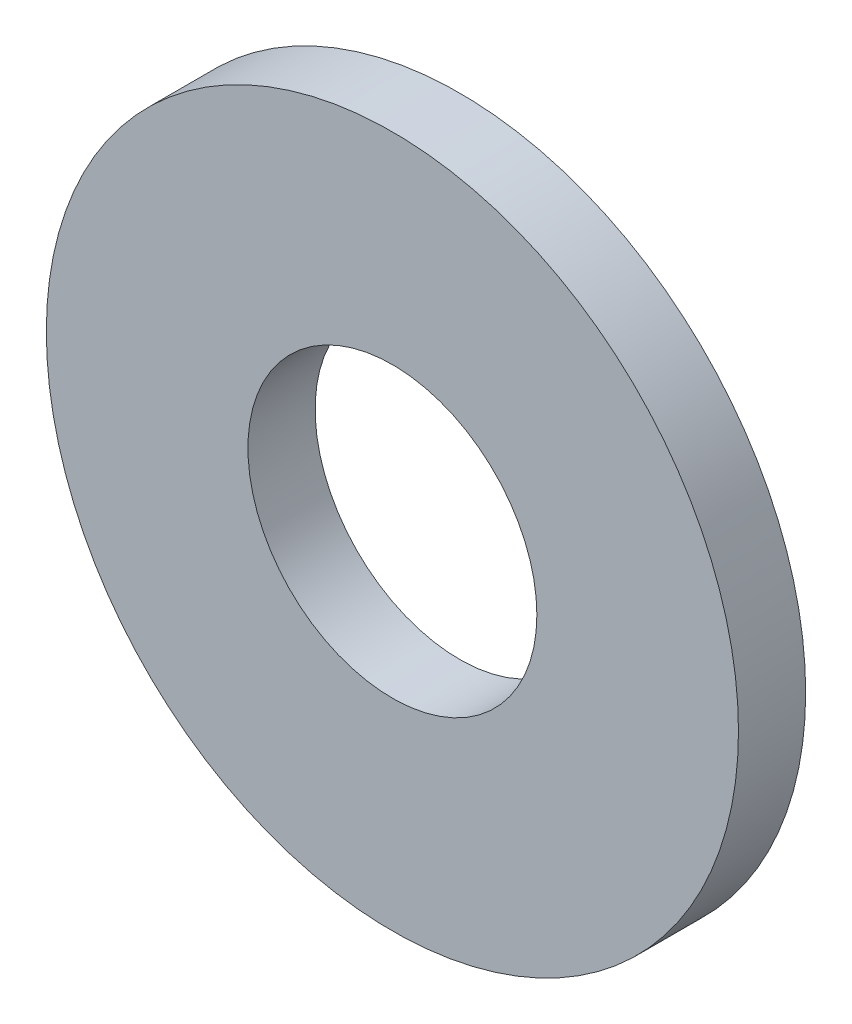
ISO-10303-21;
HEADER;
FILE_DESCRIPTION(('STEP AP214'),'2;1');
FILE_NAME('part.step','',(''),(''),'','','');
FILE_SCHEMA(('AUTOMOTIVE_DESIGN { 1 0 10303 214 1 1 1 1 }'));
ENDSEC;
DATA;
#1=APPLICATION_CONTEXT('core data for automotive mechanical design processes');
#2=APPLICATION_PROTOCOL_DEFINITION('international standard','automotive_design',2000,#1);
#3=PRODUCT_CONTEXT('',#1,'mechanical');
#4=PRODUCT('Part','Part','',(#3));
#5=PRODUCT_RELATED_PRODUCT_CATEGORY('part','',(#4));
#6=PRODUCT_DEFINITION_FORMATION('','',#4);
#7=PRODUCT_DEFINITION_CONTEXT('part definition',#1,'design');
#8=PRODUCT_DEFINITION('design','',#6,#7);
#9=PRODUCT_DEFINITION_SHAPE('','',#8);
#10=(LENGTH_UNIT() NAMED_UNIT(*) SI_UNIT(.MILLI.,.METRE.));
#11=(NAMED_UNIT(*) PLANE_ANGLE_UNIT() SI_UNIT($,.RADIAN.));
#12=(NAMED_UNIT(*) SI_UNIT($,.STERADIAN.) SOLID_ANGLE_UNIT());
#13=UNCERTAINTY_MEASURE_WITH_UNIT(LENGTH_MEASURE(1.E-05),#10,'distance_accuracy_value','');
#14=(GEOMETRIC_REPRESENTATION_CONTEXT(3) GLOBAL_UNCERTAINTY_ASSIGNED_CONTEXT((#13)) GLOBAL_UNIT_ASSIGNED_CONTEXT((#10,
#11,#12)) REPRESENTATION_CONTEXT('',''));
#15=CARTESIAN_POINT('',(0.,0.,0.));
#16=DIRECTION('',(0.,0.,1.));
#17=DIRECTION('',(1.,0.,0.));
#18=AXIS2_PLACEMENT_3D('',#15,#16,#17);
#19=CARTESIAN_POINT('',(0.,0.,1.));
#20=DIRECTION('',(0.,0.,1.));
#21=DIRECTION('',(1.,0.,0.));
#22=AXIS2_PLACEMENT_3D('',#19,#20,#21);
#23=PLANE('',#22);
#24=CARTESIAN_POINT('',(0.,0.,1.));
#25=DIRECTION('',(0.,0.,1.));
#26=DIRECTION('',(1.,0.,0.));
#27=AXIS2_PLACEMENT_3D('',#24,#25,#26);
#28=CIRCLE('',#27,5.15);
#29=CARTESIAN_POINT('',(5.15,0.,1.));
#30=VERTEX_POINT('',#29);
#31=EDGE_CURVE('E10',#30,#30,#28,.T.);
#32=ORIENTED_EDGE('',*,*,#31,.T.);
#33=EDGE_LOOP('',(#32));
#34=FACE_BOUND('',#33,.T.);
#35=CARTESIAN_POINT('',(0.,0.,1.));
#36=DIRECTION('',(0.,0.,1.));
#37=DIRECTION('',(1.,0.,0.));
#38=AXIS2_PLACEMENT_3D('',#35,#36,#37);
#39=CIRCLE('',#38,2.15);
#40=CARTESIAN_POINT('',(2.15,0.,1.));
#41=VERTEX_POINT('',#40);
#42=EDGE_CURVE('E42',#41,#41,#39,.T.);
#43=ORIENTED_EDGE('',*,*,#42,.F.);
#44=EDGE_LOOP('',(#43));
#45=FACE_BOUND('',#44,.T.);
#46=ADVANCED_FACE('F31',(#34,#45),#23,.T.);
#47=CARTESIAN_POINT('',(0.,0.,0.));
#48=DIRECTION('',(0.,0.,1.));
#49=DIRECTION('',(1.,0.,0.));
#50=AXIS2_PLACEMENT_3D('',#47,#48,#49);
#51=PLANE('',#50);
#52=CARTESIAN_POINT('',(0.,0.,0.));
#53=DIRECTION('',(0.,0.,1.));
#54=DIRECTION('',(1.,0.,0.));
#55=AXIS2_PLACEMENT_3D('',#52,#53,#54);
#56=CIRCLE('',#55,5.15);
#57=CARTESIAN_POINT('',(5.15,0.,0.));
#58=VERTEX_POINT('',#57);
#59=EDGE_CURVE('E35',#58,#58,#56,.T.);
#60=ORIENTED_EDGE('',*,*,#59,.F.);
#61=EDGE_LOOP('',(#60));
#62=FACE_BOUND('',#61,.T.);
#63=CARTESIAN_POINT('',(0.,0.,0.));
#64=DIRECTION('',(0.,0.,1.));
#65=DIRECTION('',(1.,0.,0.));
#66=AXIS2_PLACEMENT_3D('',#63,#64,#65);
#67=CIRCLE('',#66,2.15);
#68=CARTESIAN_POINT('',(2.15,0.,0.));
#69=VERTEX_POINT('',#68);
#70=EDGE_CURVE('E44',#69,#69,#67,.T.);
#71=ORIENTED_EDGE('',*,*,#70,.T.);
#72=EDGE_LOOP('',(#71));
#73=FACE_BOUND('',#72,.T.);
#74=ADVANCED_FACE('F54',(#62,#73),#51,.F.);
#75=CARTESIAN_POINT('',(0.,0.,1.));
#76=DIRECTION('',(0.,0.,-1.));
#77=DIRECTION('',(-1.,0.,0.));
#78=AXIS2_PLACEMENT_3D('',#75,#76,#77);
#79=CYLINDRICAL_SURFACE('',#78,5.15);
#80=ORIENTED_EDGE('',*,*,#31,.F.);
#81=EDGE_LOOP('',(#80));
#82=FACE_BOUND('',#81,.T.);
#83=ORIENTED_EDGE('',*,*,#59,.T.);
#84=EDGE_LOOP('',(#83));
#85=FACE_BOUND('',#84,.T.);
#86=ADVANCED_FACE('F33',(#82,#85),#79,.T.);
#87=CARTESIAN_POINT('',(0.,0.,1.));
#88=DIRECTION('',(0.,0.,-1.));
#89=DIRECTION('',(-1.,0.,0.));
#90=AXIS2_PLACEMENT_3D('',#87,#88,#89);
#91=CYLINDRICAL_SURFACE('',#90,2.15);
#92=ORIENTED_EDGE('',*,*,#42,.T.);
#93=EDGE_LOOP('',(#92));
#94=FACE_BOUND('',#93,.T.);
#95=ORIENTED_EDGE('',*,*,#70,.F.);
#96=EDGE_LOOP('',(#95));
#97=FACE_BOUND('',#96,.T.);
#98=ADVANCED_FACE('F50',(#94,#97),#91,.F.);
#99=CLOSED_SHELL('',(#46,#74,#86,#98));
#100=MANIFOLD_SOLID_BREP('B2',#99);
#101=ADVANCED_BREP_SHAPE_REPRESENTATION('',(#18,#100),#14);
#102=SHAPE_DEFINITION_REPRESENTATION(#9,#101);
ENDSEC;
END-ISO-10303-21;
